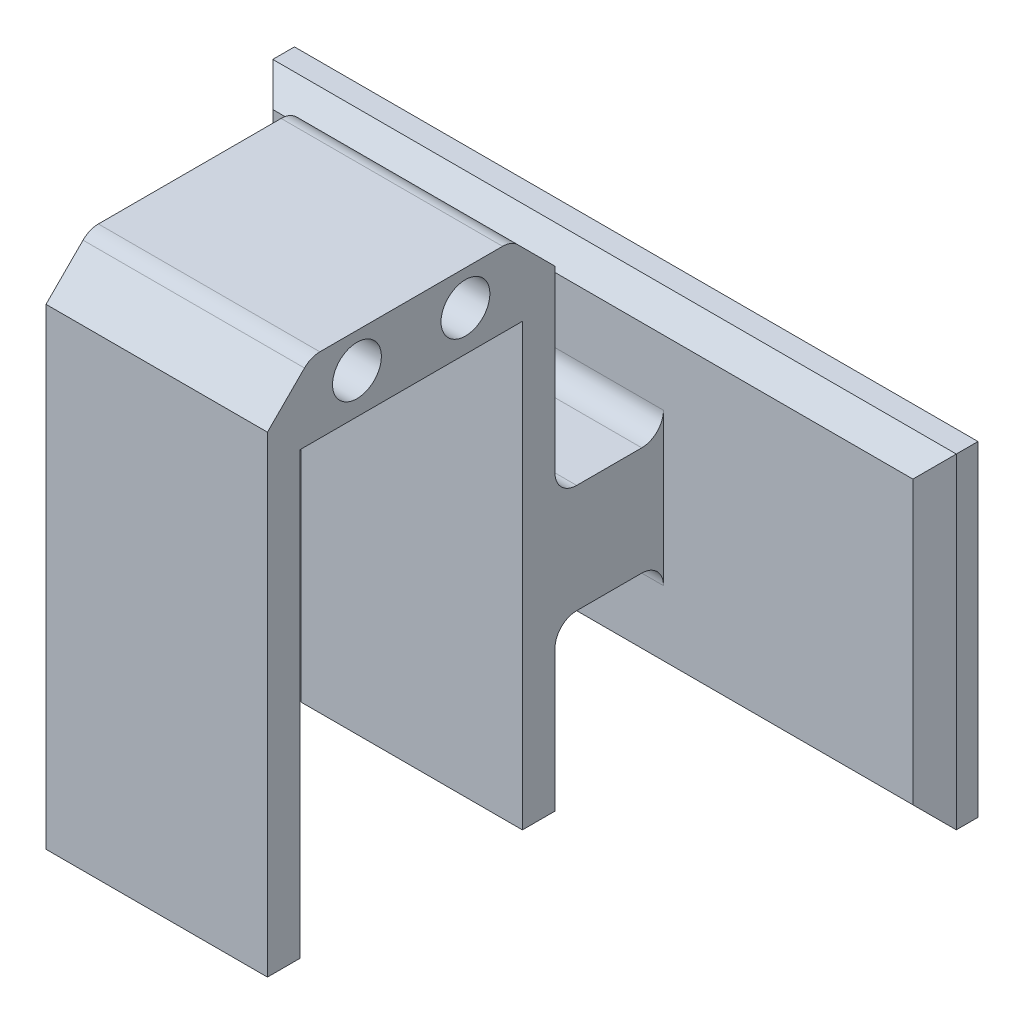
ISO-10303-21;
HEADER;
FILE_DESCRIPTION(('STEP AP214'),'2;1');
FILE_NAME('part.step','',(''),(''),'','','');
FILE_SCHEMA(('AUTOMOTIVE_DESIGN { 1 0 10303 214 1 1 1 1 }'));
ENDSEC;
DATA;
#1=APPLICATION_CONTEXT('core data for automotive mechanical design processes');
#2=APPLICATION_PROTOCOL_DEFINITION('international standard','automotive_design',2000,#1);
#3=PRODUCT_CONTEXT('',#1,'mechanical');
#4=PRODUCT('Part','Part','',(#3));
#5=PRODUCT_RELATED_PRODUCT_CATEGORY('part','',(#4));
#6=PRODUCT_DEFINITION_FORMATION('','',#4);
#7=PRODUCT_DEFINITION_CONTEXT('part definition',#1,'design');
#8=PRODUCT_DEFINITION('design','',#6,#7);
#9=PRODUCT_DEFINITION_SHAPE('','',#8);
#10=(LENGTH_UNIT() NAMED_UNIT(*) SI_UNIT(.MILLI.,.METRE.));
#11=(NAMED_UNIT(*) PLANE_ANGLE_UNIT() SI_UNIT($,.RADIAN.));
#12=(NAMED_UNIT(*) SI_UNIT($,.STERADIAN.) SOLID_ANGLE_UNIT());
#13=UNCERTAINTY_MEASURE_WITH_UNIT(LENGTH_MEASURE(1.E-05),#10,'distance_accuracy_value','');
#14=(GEOMETRIC_REPRESENTATION_CONTEXT(3) GLOBAL_UNCERTAINTY_ASSIGNED_CONTEXT((#13)) GLOBAL_UNIT_ASSIGNED_CONTEXT((#10,
#11,#12)) REPRESENTATION_CONTEXT('',''));
#15=CARTESIAN_POINT('',(0.,0.,0.));
#16=DIRECTION('',(0.,0.,1.));
#17=DIRECTION('',(1.,0.,0.));
#18=AXIS2_PLACEMENT_3D('',#15,#16,#17);
#19=CARTESIAN_POINT('',(20.,0.,-13.25));
#20=DIRECTION('',(0.,0.,1.));
#21=DIRECTION('',(0.,-1.,0.));
#22=AXIS2_PLACEMENT_3D('',#19,#20,#21);
#23=PLANE('',#22);
#24=DIRECTION('',(1.,0.,0.));
#25=VECTOR('',#24,1.);
#26=CARTESIAN_POINT('',(20.,23.2,-13.25));
#27=LINE('',#26,#25);
#28=CARTESIAN_POINT('',(0.,23.2,-13.25));
#29=VERTEX_POINT('',#28);
#30=CARTESIAN_POINT('',(20.41,23.2,-13.25));
#31=VERTEX_POINT('',#30);
#32=EDGE_CURVE('E217',#29,#31,#27,.T.);
#33=ORIENTED_EDGE('',*,*,#32,.T.);
#34=DIRECTION('',(0.,1.,0.));
#35=VECTOR('',#34,1.);
#36=CARTESIAN_POINT('',(20.41,6.7,-13.25));
#37=LINE('',#36,#35);
#38=CARTESIAN_POINT('',(20.41,6.7,-13.25));
#39=VERTEX_POINT('',#38);
#40=EDGE_CURVE('E220',#39,#31,#37,.T.);
#41=ORIENTED_EDGE('',*,*,#40,.F.);
#42=DIRECTION('',(1.,0.,0.));
#43=VECTOR('',#42,1.);
#44=CARTESIAN_POINT('',(20.,6.7,-13.25));
#45=LINE('',#44,#43);
#46=CARTESIAN_POINT('',(0.,6.7,-13.25));
#47=VERTEX_POINT('',#46);
#48=EDGE_CURVE('E392',#39,#47,#45,.F.);
#49=ORIENTED_EDGE('',*,*,#48,.T.);
#50=DIRECTION('',(0.,1.,0.));
#51=VECTOR('',#50,1.);
#52=CARTESIAN_POINT('',(0.,0.,-13.25));
#53=LINE('',#52,#51);
#54=EDGE_CURVE('E222',#47,#29,#53,.T.);
#55=ORIENTED_EDGE('',*,*,#54,.T.);
#56=EDGE_LOOP('',(#33,#41,#49,#55));
#57=FACE_BOUND('',#56,.T.);
#58=ADVANCED_FACE('F43',(#57),#23,.F.);
#59=CARTESIAN_POINT('',(20.,-20.3,0.));
#60=DIRECTION('',(0.,1.,0.));
#61=DIRECTION('',(0.,0.,1.));
#62=AXIS2_PLACEMENT_3D('',#59,#60,#61);
#63=PLANE('',#62);
#64=DIRECTION('',(0.,0.,-1.));
#65=VECTOR('',#64,1.);
#66=CARTESIAN_POINT('',(0.,-20.3,0.));
#67=LINE('',#66,#65);
#68=CARTESIAN_POINT('',(0.,-20.3,-10.25));
#69=VERTEX_POINT('',#68);
#70=CARTESIAN_POINT('',(0.,-20.3,-13.25));
#71=VERTEX_POINT('',#70);
#72=EDGE_CURVE('E339',#69,#71,#67,.T.);
#73=ORIENTED_EDGE('',*,*,#72,.T.);
#74=DIRECTION('',(-1.,0.,0.));
#75=VECTOR('',#74,1.);
#76=CARTESIAN_POINT('',(20.,-20.3,-13.25));
#77=LINE('',#76,#75);
#78=CARTESIAN_POINT('',(20.41,-20.3,-13.25));
#79=VERTEX_POINT('',#78);
#80=EDGE_CURVE('E227',#79,#71,#77,.T.);
#81=ORIENTED_EDGE('',*,*,#80,.F.);
#82=DIRECTION('',(0.,0.,-1.));
#83=VECTOR('',#82,1.);
#84=CARTESIAN_POINT('',(20.41,-20.3,-10.25));
#85=LINE('',#84,#83);
#86=CARTESIAN_POINT('',(20.41,-20.3,-10.25));
#87=VERTEX_POINT('',#86);
#88=EDGE_CURVE('E277',#87,#79,#85,.T.);
#89=ORIENTED_EDGE('',*,*,#88,.F.);
#90=DIRECTION('',(-1.,0.,0.));
#91=VECTOR('',#90,1.);
#92=CARTESIAN_POINT('',(20.,-20.3,-10.25));
#93=LINE('',#92,#91);
#94=EDGE_CURVE('E359',#87,#69,#93,.T.);
#95=ORIENTED_EDGE('',*,*,#94,.T.);
#96=EDGE_LOOP('',(#73,#81,#89,#95));
#97=FACE_BOUND('',#96,.T.);
#98=ADVANCED_FACE('F488',(#97),#63,.F.);
#99=CARTESIAN_POINT('',(0.,-7.3,-13.25));
#100=VERTEX_POINT('',#99);
#101=EDGE_CURVE('E342',#71,#100,#53,.T.);
#102=ORIENTED_EDGE('',*,*,#101,.T.);
#103=DIRECTION('',(1.,0.,0.));
#104=VECTOR('',#103,1.);
#105=CARTESIAN_POINT('',(20.,-7.3,-13.25));
#106=LINE('',#105,#104);
#107=CARTESIAN_POINT('',(20.41,-7.3,-13.25));
#108=VERTEX_POINT('',#107);
#109=EDGE_CURVE('E394',#100,#108,#106,.T.);
#110=ORIENTED_EDGE('',*,*,#109,.T.);
#111=DIRECTION('',(0.,1.,0.));
#112=VECTOR('',#111,1.);
#113=CARTESIAN_POINT('',(20.41,-20.3,-13.25));
#114=LINE('',#113,#112);
#115=EDGE_CURVE('E280',#79,#108,#114,.T.);
#116=ORIENTED_EDGE('',*,*,#115,.F.);
#117=ORIENTED_EDGE('',*,*,#80,.T.);
#118=EDGE_LOOP('',(#102,#110,#116,#117));
#119=FACE_BOUND('',#118,.T.);
#120=ADVANCED_FACE('F490',(#119),#23,.F.);
#121=CARTESIAN_POINT('',(20.,0.,13.25));
#122=DIRECTION('',(0.,0.,1.));
#123=DIRECTION('',(1.,0.,0.));
#124=AXIS2_PLACEMENT_3D('',#121,#122,#123);
#125=PLANE('',#124);
#126=DIRECTION('',(-1.,0.,0.));
#127=VECTOR('',#126,1.);
#128=CARTESIAN_POINT('',(20.,-20.3,13.25));
#129=LINE('',#128,#127);
#130=CARTESIAN_POINT('',(20.41,-20.3,13.25));
#131=VERTEX_POINT('',#130);
#132=CARTESIAN_POINT('',(0.,-20.3,13.25));
#133=VERTEX_POINT('',#132);
#134=EDGE_CURVE('E368',#131,#133,#129,.T.);
#135=ORIENTED_EDGE('',*,*,#134,.F.);
#136=DIRECTION('',(0.,-1.,0.));
#137=VECTOR('',#136,1.);
#138=CARTESIAN_POINT('',(20.41,23.2,13.25));
#139=LINE('',#138,#137);
#140=CARTESIAN_POINT('',(20.41,23.2,13.25));
#141=VERTEX_POINT('',#140);
#142=EDGE_CURVE('E262',#141,#131,#139,.T.);
#143=ORIENTED_EDGE('',*,*,#142,.F.);
#144=DIRECTION('',(-1.,0.,0.));
#145=VECTOR('',#144,1.);
#146=CARTESIAN_POINT('',(0.,23.2,13.25));
#147=LINE('',#146,#145);
#148=CARTESIAN_POINT('',(0.,23.2,13.25));
#149=VERTEX_POINT('',#148);
#150=EDGE_CURVE('E373',#141,#149,#147,.T.);
#151=ORIENTED_EDGE('',*,*,#150,.T.);
#152=DIRECTION('',(0.,1.,0.));
#153=VECTOR('',#152,1.);
#154=CARTESIAN_POINT('',(0.,0.,13.25));
#155=LINE('',#154,#153);
#156=EDGE_CURVE('E345',#133,#149,#155,.T.);
#157=ORIENTED_EDGE('',*,*,#156,.F.);
#158=EDGE_LOOP('',(#135,#143,#151,#157));
#159=FACE_BOUND('',#158,.T.);
#160=ADVANCED_FACE('F467',(#159),#125,.T.);
#161=CARTESIAN_POINT('',(20.,-20.3,0.));
#162=DIRECTION('',(0.,-1.,0.));
#163=DIRECTION('',(0.,0.,-1.));
#164=AXIS2_PLACEMENT_3D('',#161,#162,#163);
#165=PLANE('',#164);
#166=DIRECTION('',(0.,0.,1.));
#167=VECTOR('',#166,1.);
#168=CARTESIAN_POINT('',(0.,-20.3,0.));
#169=LINE('',#168,#167);
#170=CARTESIAN_POINT('',(0.,-20.3,10.25));
#171=VERTEX_POINT('',#170);
#172=EDGE_CURVE('E348',#171,#133,#169,.T.);
#173=ORIENTED_EDGE('',*,*,#172,.F.);
#174=DIRECTION('',(-1.,0.,0.));
#175=VECTOR('',#174,1.);
#176=CARTESIAN_POINT('',(20.,-20.3,10.25));
#177=LINE('',#176,#175);
#178=CARTESIAN_POINT('',(20.41,-20.3,10.25));
#179=VERTEX_POINT('',#178);
#180=EDGE_CURVE('E366',#179,#171,#177,.T.);
#181=ORIENTED_EDGE('',*,*,#180,.F.);
#182=DIRECTION('',(0.,0.,-1.));
#183=VECTOR('',#182,1.);
#184=CARTESIAN_POINT('',(20.41,-20.3,13.25));
#185=LINE('',#184,#183);
#186=EDGE_CURVE('E265',#131,#179,#185,.T.);
#187=ORIENTED_EDGE('',*,*,#186,.F.);
#188=ORIENTED_EDGE('',*,*,#134,.T.);
#189=EDGE_LOOP('',(#173,#181,#187,#188));
#190=FACE_BOUND('',#189,.T.);
#191=ADVANCED_FACE('F472',(#190),#165,.T.);
#192=CARTESIAN_POINT('',(20.,0.,10.25));
#193=DIRECTION('',(0.,0.,1.));
#194=DIRECTION('',(1.,0.,0.));
#195=AXIS2_PLACEMENT_3D('',#192,#193,#194);
#196=PLANE('',#195);
#197=DIRECTION('',(0.,1.,0.));
#198=VECTOR('',#197,1.);
#199=CARTESIAN_POINT('',(0.,0.,10.25));
#200=LINE('',#199,#198);
#201=CARTESIAN_POINT('',(0.,20.3,10.25));
#202=VERTEX_POINT('',#201);
#203=EDGE_CURVE('E351',#171,#202,#200,.T.);
#204=ORIENTED_EDGE('',*,*,#203,.T.);
#205=DIRECTION('',(-1.,0.,0.));
#206=VECTOR('',#205,1.);
#207=CARTESIAN_POINT('',(20.,20.3,10.25));
#208=LINE('',#207,#206);
#209=CARTESIAN_POINT('',(20.41,20.3,10.25));
#210=VERTEX_POINT('',#209);
#211=EDGE_CURVE('E363',#210,#202,#208,.T.);
#212=ORIENTED_EDGE('',*,*,#211,.F.);
#213=DIRECTION('',(0.,1.,0.));
#214=VECTOR('',#213,1.);
#215=CARTESIAN_POINT('',(20.41,-20.3,10.25));
#216=LINE('',#215,#214);
#217=EDGE_CURVE('E268',#179,#210,#216,.T.);
#218=ORIENTED_EDGE('',*,*,#217,.F.);
#219=ORIENTED_EDGE('',*,*,#180,.T.);
#220=EDGE_LOOP('',(#204,#212,#218,#219));
#221=FACE_BOUND('',#220,.T.);
#222=ADVANCED_FACE('F477',(#221),#196,.F.);
#223=CARTESIAN_POINT('',(20.,20.3,0.));
#224=DIRECTION('',(0.,1.,0.));
#225=DIRECTION('',(0.,0.,1.));
#226=AXIS2_PLACEMENT_3D('',#223,#224,#225);
#227=PLANE('',#226);
#228=DIRECTION('',(0.,0.,-1.));
#229=VECTOR('',#228,1.);
#230=CARTESIAN_POINT('',(0.,20.3,0.));
#231=LINE('',#230,#229);
#232=CARTESIAN_POINT('',(0.,20.3,-10.25));
#233=VERTEX_POINT('',#232);
#234=EDGE_CURVE('E353',#202,#233,#231,.T.);
#235=ORIENTED_EDGE('',*,*,#234,.T.);
#236=DIRECTION('',(-1.,0.,0.));
#237=VECTOR('',#236,1.);
#238=CARTESIAN_POINT('',(20.,20.3,-10.25));
#239=LINE('',#238,#237);
#240=CARTESIAN_POINT('',(20.41,20.3,-10.25));
#241=VERTEX_POINT('',#240);
#242=EDGE_CURVE('E361',#241,#233,#239,.T.);
#243=ORIENTED_EDGE('',*,*,#242,.F.);
#244=DIRECTION('',(0.,0.,-1.));
#245=VECTOR('',#244,1.);
#246=CARTESIAN_POINT('',(20.41,20.3,10.25));
#247=LINE('',#246,#245);
#248=EDGE_CURVE('E271',#210,#241,#247,.T.);
#249=ORIENTED_EDGE('',*,*,#248,.F.);
#250=ORIENTED_EDGE('',*,*,#211,.T.);
#251=EDGE_LOOP('',(#235,#243,#249,#250));
#252=FACE_BOUND('',#251,.T.);
#253=ADVANCED_FACE('F479',(#252),#227,.F.);
#254=CARTESIAN_POINT('',(20.,0.,-10.25));
#255=DIRECTION('',(0.,0.,1.));
#256=DIRECTION('',(1.,0.,0.));
#257=AXIS2_PLACEMENT_3D('',#254,#255,#256);
#258=PLANE('',#257);
#259=DIRECTION('',(0.,1.,0.));
#260=VECTOR('',#259,1.);
#261=CARTESIAN_POINT('',(0.,0.,-10.25));
#262=LINE('',#261,#260);
#263=EDGE_CURVE('E356',#69,#233,#262,.T.);
#264=ORIENTED_EDGE('',*,*,#263,.F.);
#265=ORIENTED_EDGE('',*,*,#94,.F.);
#266=DIRECTION('',(0.,-1.,0.));
#267=VECTOR('',#266,1.);
#268=CARTESIAN_POINT('',(20.41,20.3,-10.25));
#269=LINE('',#268,#267);
#270=EDGE_CURVE('E274',#241,#87,#269,.T.);
#271=ORIENTED_EDGE('',*,*,#270,.F.);
#272=ORIENTED_EDGE('',*,*,#242,.T.);
#273=EDGE_LOOP('',(#264,#265,#271,#272));
#274=FACE_BOUND('',#273,.T.);
#275=ADVANCED_FACE('F483',(#274),#258,.T.);
#276=CARTESIAN_POINT('',(0.,0.,0.));
#277=DIRECTION('',(1.,0.,0.));
#278=DIRECTION('',(0.,0.,-1.));
#279=AXIS2_PLACEMENT_3D('',#276,#277,#278);
#280=PLANE('',#279);
#281=DIRECTION('',(0.,0.,-1.));
#282=VECTOR('',#281,1.);
#283=CARTESIAN_POINT('',(0.,27.2,13.25));
#284=LINE('',#283,#282);
#285=CARTESIAN_POINT('',(0.,27.2,8.42157287525382));
#286=VERTEX_POINT('',#285);
#287=CARTESIAN_POINT('',(0.,27.2,-8.4215728752538));
#288=VERTEX_POINT('',#287);
#289=EDGE_CURVE('E330',#286,#288,#284,.T.);
#290=ORIENTED_EDGE('',*,*,#289,.T.);
#291=CARTESIAN_POINT('',(0.,25.2,-8.4215728752538));
#292=DIRECTION('',(1.,0.,0.));
#293=DIRECTION('',(0.,0.,-1.));
#294=AXIS2_PLACEMENT_3D('',#291,#292,#293);
#295=CIRCLE('',#294,2.);
#296=CARTESIAN_POINT('',(0.,26.6142135623731,-9.83578643762689));
#297=VERTEX_POINT('',#296);
#298=EDGE_CURVE('E385',#288,#297,#295,.F.);
#299=ORIENTED_EDGE('',*,*,#298,.T.);
#300=DIRECTION('',(0.,0.707106781186546,0.707106781186549));
#301=VECTOR('',#300,1.);
#302=CARTESIAN_POINT('',(0.,23.2,-13.25));
#303=LINE('',#302,#301);
#304=EDGE_CURVE('E226',#297,#29,#303,.F.);
#305=ORIENTED_EDGE('',*,*,#304,.T.);
#306=ORIENTED_EDGE('',*,*,#54,.F.);
#307=CARTESIAN_POINT('',(0.,6.7,-15.25));
#308=DIRECTION('',(1.,0.,0.));
#309=DIRECTION('',(0.,0.,-1.));
#310=AXIS2_PLACEMENT_3D('',#307,#308,#309);
#311=CIRCLE('',#310,2.);
#312=CARTESIAN_POINT('',(0.,4.7,-15.25));
#313=VERTEX_POINT('',#312);
#314=EDGE_CURVE('E399',#47,#313,#311,.T.);
#315=ORIENTED_EDGE('',*,*,#314,.T.);
#316=DIRECTION('',(0.,0.,-1.));
#317=VECTOR('',#316,1.);
#318=CARTESIAN_POINT('',(0.,4.7,-13.25));
#319=LINE('',#318,#317);
#320=CARTESIAN_POINT('',(0.,4.7,-21.25));
#321=VERTEX_POINT('',#320);
#322=EDGE_CURVE('E327',#313,#321,#319,.T.);
#323=ORIENTED_EDGE('',*,*,#322,.T.);
#324=CARTESIAN_POINT('',(0.,6.7,-21.25));
#325=DIRECTION('',(1.,0.,0.));
#326=DIRECTION('',(0.,0.,-1.));
#327=AXIS2_PLACEMENT_3D('',#324,#325,#326);
#328=CIRCLE('',#327,2.);
#329=CARTESIAN_POINT('',(0.,6.7,-23.25));
#330=VERTEX_POINT('',#329);
#331=EDGE_CURVE('E51',#321,#330,#328,.T.);
#332=ORIENTED_EDGE('',*,*,#331,.T.);
#333=DIRECTION('',(0.,-1.,0.));
#334=VECTOR('',#333,1.);
#335=CARTESIAN_POINT('',(0.,4.7,-23.25));
#336=LINE('',#335,#334);
#337=CARTESIAN_POINT('',(0.,-7.3,-23.25));
#338=VERTEX_POINT('',#337);
#339=EDGE_CURVE('E325',#330,#338,#336,.T.);
#340=ORIENTED_EDGE('',*,*,#339,.T.);
#341=CARTESIAN_POINT('',(0.,-7.3,-21.25));
#342=DIRECTION('',(1.,0.,0.));
#343=DIRECTION('',(0.,0.,-1.));
#344=AXIS2_PLACEMENT_3D('',#341,#342,#343);
#345=CIRCLE('',#344,2.);
#346=CARTESIAN_POINT('',(0.,-5.3,-21.25));
#347=VERTEX_POINT('',#346);
#348=EDGE_CURVE('E11',#338,#347,#345,.T.);
#349=ORIENTED_EDGE('',*,*,#348,.T.);
#350=DIRECTION('',(0.,0.,1.));
#351=VECTOR('',#350,1.);
#352=CARTESIAN_POINT('',(0.,-5.3,-23.25));
#353=LINE('',#352,#351);
#354=CARTESIAN_POINT('',(0.,-5.3,-15.25));
#355=VERTEX_POINT('',#354);
#356=EDGE_CURVE('E323',#347,#355,#353,.T.);
#357=ORIENTED_EDGE('',*,*,#356,.T.);
#358=CARTESIAN_POINT('',(0.,-7.3,-15.25));
#359=DIRECTION('',(1.,0.,0.));
#360=DIRECTION('',(0.,0.,-1.));
#361=AXIS2_PLACEMENT_3D('',#358,#359,#360);
#362=CIRCLE('',#361,2.);
#363=EDGE_CURVE('E401',#355,#100,#362,.T.);
#364=ORIENTED_EDGE('',*,*,#363,.T.);
#365=ORIENTED_EDGE('',*,*,#101,.F.);
#366=ORIENTED_EDGE('',*,*,#72,.F.);
#367=ORIENTED_EDGE('',*,*,#263,.T.);
#368=ORIENTED_EDGE('',*,*,#234,.F.);
#369=ORIENTED_EDGE('',*,*,#203,.F.);
#370=ORIENTED_EDGE('',*,*,#172,.T.);
#371=ORIENTED_EDGE('',*,*,#156,.T.);
#372=DIRECTION('',(0.,0.707106781186549,-0.707106781186546));
#373=VECTOR('',#372,1.);
#374=CARTESIAN_POINT('',(0.,27.2,9.25000000000001));
#375=LINE('',#374,#373);
#376=CARTESIAN_POINT('',(0.,26.6142135623731,9.83578643762692));
#377=VERTEX_POINT('',#376);
#378=EDGE_CURVE('E375',#149,#377,#375,.T.);
#379=ORIENTED_EDGE('',*,*,#378,.T.);
#380=CARTESIAN_POINT('',(0.,25.2,8.42157287525382));
#381=DIRECTION('',(1.,0.,0.));
#382=DIRECTION('',(0.,0.,-1.));
#383=AXIS2_PLACEMENT_3D('',#380,#381,#382);
#384=CIRCLE('',#383,2.);
#385=EDGE_CURVE('E383',#377,#286,#384,.F.);
#386=ORIENTED_EDGE('',*,*,#385,.T.);
#387=EDGE_LOOP('',(#290,#299,#305,#306,#315,#323,#332,#340,#349,#357,#364,#365,#366,#367,#368,
#369,#370,#371,#379,#386));
#388=FACE_BOUND('',#387,.T.);
#389=ADVANCED_FACE('F437',(#388),#280,.F.);
#390=CARTESIAN_POINT('',(0.,27.2,13.25));
#391=DIRECTION('',(0.,-1.,0.));
#392=DIRECTION('',(0.,0.,-1.));
#393=AXIS2_PLACEMENT_3D('',#390,#391,#392);
#394=PLANE('',#393);
#395=DIRECTION('',(1.,0.,0.));
#396=VECTOR('',#395,1.);
#397=CARTESIAN_POINT('',(20.,27.2,8.42157287525382));
#398=LINE('',#397,#396);
#399=CARTESIAN_POINT('',(20.41,27.2,8.42157287525382));
#400=VERTEX_POINT('',#399);
#401=EDGE_CURVE('E378',#286,#400,#398,.T.);
#402=ORIENTED_EDGE('',*,*,#401,.T.);
#403=DIRECTION('',(0.,0.,1.));
#404=VECTOR('',#403,1.);
#405=CARTESIAN_POINT('',(20.41,27.2,-8.4215728752538));
#406=LINE('',#405,#404);
#407=CARTESIAN_POINT('',(20.41,27.2,-8.4215728752538));
#408=VERTEX_POINT('',#407);
#409=EDGE_CURVE('E253',#408,#400,#406,.T.);
#410=ORIENTED_EDGE('',*,*,#409,.F.);
#411=DIRECTION('',(1.,0.,0.));
#412=VECTOR('',#411,1.);
#413=CARTESIAN_POINT('',(0.,27.2,-8.4215728752538));
#414=LINE('',#413,#412);
#415=EDGE_CURVE('E380',#408,#288,#414,.F.);
#416=ORIENTED_EDGE('',*,*,#415,.T.);
#417=ORIENTED_EDGE('',*,*,#289,.F.);
#418=EDGE_LOOP('',(#402,#410,#416,#417));
#419=FACE_BOUND('',#418,.T.);
#420=ADVANCED_FACE('F454',(#419),#394,.F.);
#421=CARTESIAN_POINT('',(20.,23.2,-13.25));
#422=DIRECTION('',(0.,-0.707106781186549,0.707106781186546));
#423=DIRECTION('',(1.,0.,0.));
#424=AXIS2_PLACEMENT_3D('',#421,#422,#423);
#425=PLANE('',#424);
#426=ORIENTED_EDGE('',*,*,#304,.F.);
#427=DIRECTION('',(-1.,0.,0.));
#428=VECTOR('',#427,1.);
#429=CARTESIAN_POINT('',(20.,26.6142135623731,-9.83578643762689));
#430=LINE('',#429,#428);
#431=CARTESIAN_POINT('',(20.41,26.6142135623731,-9.83578643762689));
#432=VERTEX_POINT('',#431);
#433=EDGE_CURVE('E233',#297,#432,#430,.F.);
#434=ORIENTED_EDGE('',*,*,#433,.T.);
#435=DIRECTION('',(0.,0.707106781186546,0.707106781186549));
#436=VECTOR('',#435,1.);
#437=CARTESIAN_POINT('',(20.41,23.2,-13.25));
#438=LINE('',#437,#436);
#439=EDGE_CURVE('E230',#31,#432,#438,.T.);
#440=ORIENTED_EDGE('',*,*,#439,.F.);
#441=ORIENTED_EDGE('',*,*,#32,.F.);
#442=EDGE_LOOP('',(#426,#434,#440,#441));
#443=FACE_BOUND('',#442,.T.);
#444=ADVANCED_FACE('F231',(#443),#425,.F.);
#445=CARTESIAN_POINT('',(0.,27.2,9.25000000000001));
#446=DIRECTION('',(0.,0.707106781186546,0.707106781186549));
#447=DIRECTION('',(-1.,0.,0.));
#448=AXIS2_PLACEMENT_3D('',#445,#446,#447);
#449=PLANE('',#448);
#450=ORIENTED_EDGE('',*,*,#150,.F.);
#451=DIRECTION('',(0.,-0.707106781186549,0.707106781186546));
#452=VECTOR('',#451,1.);
#453=CARTESIAN_POINT('',(20.41,26.6142135623731,9.83578643762692));
#454=LINE('',#453,#452);
#455=CARTESIAN_POINT('',(20.41,26.6142135623731,9.83578643762692));
#456=VERTEX_POINT('',#455);
#457=EDGE_CURVE('E259',#456,#141,#454,.T.);
#458=ORIENTED_EDGE('',*,*,#457,.F.);
#459=DIRECTION('',(1.,0.,0.));
#460=VECTOR('',#459,1.);
#461=CARTESIAN_POINT('',(0.,26.6142135623731,9.83578643762692));
#462=LINE('',#461,#460);
#463=EDGE_CURVE('E388',#456,#377,#462,.F.);
#464=ORIENTED_EDGE('',*,*,#463,.T.);
#465=ORIENTED_EDGE('',*,*,#378,.F.);
#466=EDGE_LOOP('',(#450,#458,#464,#465));
#467=FACE_BOUND('',#466,.T.);
#468=ADVANCED_FACE('F463',(#467),#449,.T.);
#469=CARTESIAN_POINT('',(0.,25.2,-8.4215728752538));
#470=DIRECTION('',(-1.,0.,0.));
#471=DIRECTION('',(0.,0.,1.));
#472=AXIS2_PLACEMENT_3D('',#469,#470,#471);
#473=CYLINDRICAL_SURFACE('',#472,2.);
#474=ORIENTED_EDGE('',*,*,#415,.F.);
#475=CARTESIAN_POINT('',(20.41,25.2,-8.4215728752538));
#476=DIRECTION('',(1.,0.,0.));
#477=DIRECTION('',(0.,0.,-1.));
#478=AXIS2_PLACEMENT_3D('',#475,#476,#477);
#479=CIRCLE('',#478,2.);
#480=EDGE_CURVE('E237',#432,#408,#479,.T.);
#481=ORIENTED_EDGE('',*,*,#480,.F.);
#482=ORIENTED_EDGE('',*,*,#433,.F.);
#483=ORIENTED_EDGE('',*,*,#298,.F.);
#484=EDGE_LOOP('',(#474,#481,#482,#483));
#485=FACE_BOUND('',#484,.T.);
#486=ADVANCED_FACE('F450',(#485),#473,.T.);
#487=CARTESIAN_POINT('',(0.,25.2,8.42157287525382));
#488=DIRECTION('',(-1.,0.,0.));
#489=DIRECTION('',(0.,0.,1.));
#490=AXIS2_PLACEMENT_3D('',#487,#488,#489);
#491=CYLINDRICAL_SURFACE('',#490,2.);
#492=ORIENTED_EDGE('',*,*,#385,.F.);
#493=ORIENTED_EDGE('',*,*,#463,.F.);
#494=CARTESIAN_POINT('',(20.41,25.2,8.42157287525382));
#495=DIRECTION('',(1.,0.,0.));
#496=DIRECTION('',(0.,0.,-1.));
#497=AXIS2_PLACEMENT_3D('',#494,#495,#496);
#498=CIRCLE('',#497,2.);
#499=EDGE_CURVE('E256',#400,#456,#498,.T.);
#500=ORIENTED_EDGE('',*,*,#499,.F.);
#501=ORIENTED_EDGE('',*,*,#401,.F.);
#502=EDGE_LOOP('',(#492,#493,#500,#501));
#503=FACE_BOUND('',#502,.T.);
#504=ADVANCED_FACE('F459',(#503),#491,.T.);
#505=CARTESIAN_POINT('',(-14.142135623731,-5.3,-23.25));
#506=DIRECTION('',(0.,-1.,0.));
#507=DIRECTION('',(0.,0.,-1.));
#508=AXIS2_PLACEMENT_3D('',#505,#506,#507);
#509=PLANE('',#508);
#510=ORIENTED_EDGE('',*,*,#356,.F.);
#511=DIRECTION('',(1.,0.,0.));
#512=VECTOR('',#511,1.);
#513=CARTESIAN_POINT('',(-14.142135623731,-5.3,-21.25));
#514=LINE('',#513,#512);
#515=CARTESIAN_POINT('',(20.41,-5.3,-21.25));
#516=VERTEX_POINT('',#515);
#517=EDGE_CURVE('E433',#347,#516,#514,.T.);
#518=ORIENTED_EDGE('',*,*,#517,.T.);
#519=DIRECTION('',(0.,0.,-1.));
#520=VECTOR('',#519,1.);
#521=CARTESIAN_POINT('',(20.41,-5.3,-15.25));
#522=LINE('',#521,#520);
#523=CARTESIAN_POINT('',(20.41,-5.3,-15.25));
#524=VERTEX_POINT('',#523);
#525=EDGE_CURVE('E286',#524,#516,#522,.T.);
#526=ORIENTED_EDGE('',*,*,#525,.F.);
#527=DIRECTION('',(1.,0.,0.));
#528=VECTOR('',#527,1.);
#529=CARTESIAN_POINT('',(-14.142135623731,-5.3,-15.25));
#530=LINE('',#529,#528);
#531=EDGE_CURVE('E396',#524,#355,#530,.F.);
#532=ORIENTED_EDGE('',*,*,#531,.T.);
#533=EDGE_LOOP('',(#510,#518,#526,#532));
#534=FACE_BOUND('',#533,.T.);
#535=ADVANCED_FACE('F499',(#534),#509,.T.);
#536=CARTESIAN_POINT('',(-14.142135623731,4.7,-13.25));
#537=DIRECTION('',(0.,1.,0.));
#538=DIRECTION('',(0.,0.,1.));
#539=AXIS2_PLACEMENT_3D('',#536,#537,#538);
#540=PLANE('',#539);
#541=DIRECTION('',(1.,0.,0.));
#542=VECTOR('',#541,1.);
#543=CARTESIAN_POINT('',(-14.142135623731,4.7,-15.25));
#544=LINE('',#543,#542);
#545=CARTESIAN_POINT('',(20.41,4.7,-15.25));
#546=VERTEX_POINT('',#545);
#547=EDGE_CURVE('E390',#313,#546,#544,.T.);
#548=ORIENTED_EDGE('',*,*,#547,.T.);
#549=DIRECTION('',(0.,0.,1.));
#550=VECTOR('',#549,1.);
#551=CARTESIAN_POINT('',(20.41,4.7,-21.25));
#552=LINE('',#551,#550);
#553=CARTESIAN_POINT('',(20.41,4.7,-21.25));
#554=VERTEX_POINT('',#553);
#555=EDGE_CURVE('E297',#554,#546,#552,.T.);
#556=ORIENTED_EDGE('',*,*,#555,.F.);
#557=DIRECTION('',(1.,0.,0.));
#558=VECTOR('',#557,1.);
#559=CARTESIAN_POINT('',(-14.142135623731,4.7,-21.25));
#560=LINE('',#559,#558);
#561=EDGE_CURVE('E431',#554,#321,#560,.F.);
#562=ORIENTED_EDGE('',*,*,#561,.T.);
#563=ORIENTED_EDGE('',*,*,#322,.F.);
#564=EDGE_LOOP('',(#548,#556,#562,#563));
#565=FACE_BOUND('',#564,.T.);
#566=ADVANCED_FACE('F444',(#565),#540,.T.);
#567=CARTESIAN_POINT('',(-14.142135623731,6.7,-15.25));
#568=DIRECTION('',(1.,0.,0.));
#569=DIRECTION('',(0.,0.,-1.));
#570=AXIS2_PLACEMENT_3D('',#567,#568,#569);
#571=CYLINDRICAL_SURFACE('',#570,2.);
#572=ORIENTED_EDGE('',*,*,#314,.F.);
#573=ORIENTED_EDGE('',*,*,#48,.F.);
#574=CARTESIAN_POINT('',(20.41,6.7,-15.25));
#575=DIRECTION('',(-1.,0.,0.));
#576=DIRECTION('',(0.,0.,-1.));
#577=AXIS2_PLACEMENT_3D('',#574,#575,#576);
#578=CIRCLE('',#577,2.);
#579=EDGE_CURVE('E244',#546,#39,#578,.T.);
#580=ORIENTED_EDGE('',*,*,#579,.F.);
#581=ORIENTED_EDGE('',*,*,#547,.F.);
#582=EDGE_LOOP('',(#572,#573,#580,#581));
#583=FACE_BOUND('',#582,.T.);
#584=ADVANCED_FACE('F448',(#583),#571,.F.);
#585=CARTESIAN_POINT('',(20.,-7.3,-15.25));
#586=DIRECTION('',(1.,0.,0.));
#587=DIRECTION('',(0.,0.,-1.));
#588=AXIS2_PLACEMENT_3D('',#585,#586,#587);
#589=CYLINDRICAL_SURFACE('',#588,2.);
#590=ORIENTED_EDGE('',*,*,#363,.F.);
#591=ORIENTED_EDGE('',*,*,#531,.F.);
#592=CARTESIAN_POINT('',(20.41,-7.3,-15.25));
#593=DIRECTION('',(-1.,0.,0.));
#594=DIRECTION('',(0.,0.,-1.));
#595=AXIS2_PLACEMENT_3D('',#592,#593,#594);
#596=CIRCLE('',#595,2.);
#597=EDGE_CURVE('E283',#108,#524,#596,.T.);
#598=ORIENTED_EDGE('',*,*,#597,.F.);
#599=ORIENTED_EDGE('',*,*,#109,.F.);
#600=EDGE_LOOP('',(#590,#591,#598,#599));
#601=FACE_BOUND('',#600,.T.);
#602=ADVANCED_FACE('F496',(#601),#589,.F.);
#603=CARTESIAN_POINT('',(45.4,14.7,-27.25));
#604=DIRECTION('',(-1.,0.,0.));
#605=DIRECTION('',(0.,0.,1.));
#606=AXIS2_PLACEMENT_3D('',#603,#604,#605);
#607=PLANE('',#606);
#608=DIRECTION('',(0.,0.,1.));
#609=VECTOR('',#608,1.);
#610=CARTESIAN_POINT('',(45.4,14.7,-27.25));
#611=LINE('',#610,#609);
#612=CARTESIAN_POINT('',(45.4,14.7,-27.25));
#613=VERTEX_POINT('',#612);
#614=CARTESIAN_POINT('',(45.4,14.7,-25.25));
#615=VERTEX_POINT('',#614);
#616=EDGE_CURVE('E311',#613,#615,#611,.T.);
#617=ORIENTED_EDGE('',*,*,#616,.T.);
#618=DIRECTION('',(0.,-1.,0.));
#619=VECTOR('',#618,1.);
#620=CARTESIAN_POINT('',(45.4,14.7,-25.25));
#621=LINE('',#620,#619);
#622=CARTESIAN_POINT('',(45.4,-15.3,-25.25));
#623=VERTEX_POINT('',#622);
#624=EDGE_CURVE('E417',#615,#623,#621,.T.);
#625=ORIENTED_EDGE('',*,*,#624,.T.);
#626=DIRECTION('',(0.,0.,1.));
#627=VECTOR('',#626,1.);
#628=CARTESIAN_POINT('',(45.4,-15.3,-27.25));
#629=LINE('',#628,#627);
#630=CARTESIAN_POINT('',(45.4,-15.3,-27.25));
#631=VERTEX_POINT('',#630);
#632=EDGE_CURVE('E320',#631,#623,#629,.T.);
#633=ORIENTED_EDGE('',*,*,#632,.F.);
#634=DIRECTION('',(0.,-1.,0.));
#635=VECTOR('',#634,1.);
#636=CARTESIAN_POINT('',(45.4,14.7,-27.25));
#637=LINE('',#636,#635);
#638=EDGE_CURVE('E301',#613,#631,#637,.T.);
#639=ORIENTED_EDGE('',*,*,#638,.F.);
#640=EDGE_LOOP('',(#617,#625,#633,#639));
#641=FACE_BOUND('',#640,.T.);
#642=ADVANCED_FACE('F549',(#641),#607,.F.);
#643=CARTESIAN_POINT('',(45.4,-15.3,-27.25));
#644=DIRECTION('',(0.,1.,0.));
#645=DIRECTION('',(-1.,0.,0.));
#646=AXIS2_PLACEMENT_3D('',#643,#644,#645);
#647=PLANE('',#646);
#648=ORIENTED_EDGE('',*,*,#632,.T.);
#649=DIRECTION('',(-1.,0.,0.));
#650=VECTOR('',#649,1.);
#651=CARTESIAN_POINT('',(45.4,-15.3,-25.25));
#652=LINE('',#651,#650);
#653=CARTESIAN_POINT('',(-17.6,-15.3,-25.25));
#654=VERTEX_POINT('',#653);
#655=EDGE_CURVE('E415',#623,#654,#652,.T.);
#656=ORIENTED_EDGE('',*,*,#655,.T.);
#657=DIRECTION('',(0.,0.,1.));
#658=VECTOR('',#657,1.);
#659=CARTESIAN_POINT('',(-17.6,-15.3,-27.25));
#660=LINE('',#659,#658);
#661=CARTESIAN_POINT('',(-17.6,-15.3,-27.25));
#662=VERTEX_POINT('',#661);
#663=EDGE_CURVE('E317',#662,#654,#660,.T.);
#664=ORIENTED_EDGE('',*,*,#663,.F.);
#665=DIRECTION('',(-1.,0.,0.));
#666=VECTOR('',#665,1.);
#667=CARTESIAN_POINT('',(45.4,-15.3,-27.25));
#668=LINE('',#667,#666);
#669=EDGE_CURVE('E304',#631,#662,#668,.T.);
#670=ORIENTED_EDGE('',*,*,#669,.F.);
#671=EDGE_LOOP('',(#648,#656,#664,#670));
#672=FACE_BOUND('',#671,.T.);
#673=ADVANCED_FACE('F552',(#672),#647,.F.);
#674=CARTESIAN_POINT('',(-17.6,14.7,-27.25));
#675=DIRECTION('',(1.,0.,0.));
#676=DIRECTION('',(0.,0.,-1.));
#677=AXIS2_PLACEMENT_3D('',#674,#675,#676);
#678=PLANE('',#677);
#679=ORIENTED_EDGE('',*,*,#663,.T.);
#680=DIRECTION('',(0.,1.,0.));
#681=VECTOR('',#680,1.);
#682=CARTESIAN_POINT('',(-17.6,14.7,-25.25));
#683=LINE('',#682,#681);
#684=CARTESIAN_POINT('',(-17.6,14.7,-25.25));
#685=VERTEX_POINT('',#684);
#686=EDGE_CURVE('E403',#654,#685,#683,.T.);
#687=ORIENTED_EDGE('',*,*,#686,.T.);
#688=DIRECTION('',(0.,0.,1.));
#689=VECTOR('',#688,1.);
#690=CARTESIAN_POINT('',(-17.6,14.7,-27.25));
#691=LINE('',#690,#689);
#692=CARTESIAN_POINT('',(-17.6,14.7,-27.25));
#693=VERTEX_POINT('',#692);
#694=EDGE_CURVE('E314',#693,#685,#691,.T.);
#695=ORIENTED_EDGE('',*,*,#694,.F.);
#696=DIRECTION('',(0.,1.,0.));
#697=VECTOR('',#696,1.);
#698=CARTESIAN_POINT('',(-17.6,14.7,-27.25));
#699=LINE('',#698,#697);
#700=EDGE_CURVE('E307',#662,#693,#699,.T.);
#701=ORIENTED_EDGE('',*,*,#700,.F.);
#702=EDGE_LOOP('',(#679,#687,#695,#701));
#703=FACE_BOUND('',#702,.T.);
#704=ADVANCED_FACE('F556',(#703),#678,.F.);
#705=CARTESIAN_POINT('',(45.4,14.7,-27.25));
#706=DIRECTION('',(0.,-1.,0.));
#707=DIRECTION('',(1.,0.,0.));
#708=AXIS2_PLACEMENT_3D('',#705,#706,#707);
#709=PLANE('',#708);
#710=ORIENTED_EDGE('',*,*,#694,.T.);
#711=DIRECTION('',(1.,0.,0.));
#712=VECTOR('',#711,1.);
#713=CARTESIAN_POINT('',(45.4,14.7,-25.25));
#714=LINE('',#713,#712);
#715=EDGE_CURVE('E419',#685,#615,#714,.T.);
#716=ORIENTED_EDGE('',*,*,#715,.T.);
#717=ORIENTED_EDGE('',*,*,#616,.F.);
#718=DIRECTION('',(1.,0.,0.));
#719=VECTOR('',#718,1.);
#720=CARTESIAN_POINT('',(45.4,14.7,-27.25));
#721=LINE('',#720,#719);
#722=EDGE_CURVE('E309',#693,#613,#721,.T.);
#723=ORIENTED_EDGE('',*,*,#722,.F.);
#724=EDGE_LOOP('',(#710,#716,#717,#723));
#725=FACE_BOUND('',#724,.T.);
#726=ADVANCED_FACE('F560',(#725),#709,.F.);
#727=CARTESIAN_POINT('',(0.,0.,-27.25));
#728=DIRECTION('',(0.,0.,-1.));
#729=DIRECTION('',(-1.,0.,0.));
#730=AXIS2_PLACEMENT_3D('',#727,#728,#729);
#731=PLANE('',#730);
#732=ORIENTED_EDGE('',*,*,#638,.T.);
#733=ORIENTED_EDGE('',*,*,#669,.T.);
#734=ORIENTED_EDGE('',*,*,#700,.T.);
#735=ORIENTED_EDGE('',*,*,#722,.T.);
#736=EDGE_LOOP('',(#732,#733,#734,#735));
#737=FACE_BOUND('',#736,.T.);
#738=ADVANCED_FACE('F564',(#737),#731,.T.);
#739=CARTESIAN_POINT('',(0.,0.,-23.25));
#740=DIRECTION('',(0.,0.,-1.));
#741=DIRECTION('',(-1.,0.,0.));
#742=AXIS2_PLACEMENT_3D('',#739,#740,#741);
#743=PLANE('',#742);
#744=DIRECTION('',(-1.,0.,0.));
#745=VECTOR('',#744,1.);
#746=CARTESIAN_POINT('',(0.,12.7,-23.25));
#747=LINE('',#746,#745);
#748=CARTESIAN_POINT('',(43.4,12.7,-23.25));
#749=VERTEX_POINT('',#748);
#750=CARTESIAN_POINT('',(-15.6,12.7,-23.25));
#751=VERTEX_POINT('',#750);
#752=EDGE_CURVE('E406',#749,#751,#747,.T.);
#753=ORIENTED_EDGE('',*,*,#752,.T.);
#754=DIRECTION('',(0.,-1.,0.));
#755=VECTOR('',#754,1.);
#756=CARTESIAN_POINT('',(-15.6,0.,-23.25));
#757=LINE('',#756,#755);
#758=CARTESIAN_POINT('',(-15.6,-13.3,-23.25));
#759=VERTEX_POINT('',#758);
#760=EDGE_CURVE('E412',#751,#759,#757,.T.);
#761=ORIENTED_EDGE('',*,*,#760,.T.);
#762=DIRECTION('',(1.,0.,0.));
#763=VECTOR('',#762,1.);
#764=CARTESIAN_POINT('',(0.,-13.3,-23.25));
#765=LINE('',#764,#763);
#766=CARTESIAN_POINT('',(43.4,-13.3,-23.25));
#767=VERTEX_POINT('',#766);
#768=EDGE_CURVE('E410',#759,#767,#765,.T.);
#769=ORIENTED_EDGE('',*,*,#768,.T.);
#770=DIRECTION('',(0.,1.,0.));
#771=VECTOR('',#770,1.);
#772=CARTESIAN_POINT('',(43.4,0.,-23.25));
#773=LINE('',#772,#771);
#774=EDGE_CURVE('E408',#767,#749,#773,.T.);
#775=ORIENTED_EDGE('',*,*,#774,.T.);
#776=EDGE_LOOP('',(#753,#761,#769,#775));
#777=FACE_BOUND('',#776,.T.);
#778=DIRECTION('',(0.,1.,0.));
#779=VECTOR('',#778,1.);
#780=CARTESIAN_POINT('',(20.41,-7.3,-23.25));
#781=LINE('',#780,#779);
#782=CARTESIAN_POINT('',(20.41,-7.3,-23.25));
#783=VERTEX_POINT('',#782);
#784=CARTESIAN_POINT('',(20.41,6.7,-23.25));
#785=VERTEX_POINT('',#784);
#786=EDGE_CURVE('E292',#783,#785,#781,.T.);
#787=ORIENTED_EDGE('',*,*,#786,.F.);
#788=DIRECTION('',(1.,0.,0.));
#789=VECTOR('',#788,1.);
#790=CARTESIAN_POINT('',(0.,-7.3,-23.25));
#791=LINE('',#790,#789);
#792=EDGE_CURVE('E58',#783,#338,#791,.F.);
#793=ORIENTED_EDGE('',*,*,#792,.T.);
#794=ORIENTED_EDGE('',*,*,#339,.F.);
#795=DIRECTION('',(1.,0.,0.));
#796=VECTOR('',#795,1.);
#797=CARTESIAN_POINT('',(0.,6.7,-23.25));
#798=LINE('',#797,#796);
#799=EDGE_CURVE('E65',#330,#785,#798,.T.);
#800=ORIENTED_EDGE('',*,*,#799,.T.);
#801=EDGE_LOOP('',(#787,#793,#794,#800));
#802=FACE_BOUND('',#801,.T.);
#803=ADVANCED_FACE('F566',(#777,#802),#743,.F.);
#804=CARTESIAN_POINT('',(45.4,14.7,-25.25));
#805=DIRECTION('',(-0.707106781186545,0.,-0.70710678118655));
#806=DIRECTION('',(0.,-1.,0.));
#807=AXIS2_PLACEMENT_3D('',#804,#805,#806);
#808=PLANE('',#807);
#809=DIRECTION('',(0.577350269189627,0.577350269189627,-0.577350269189623));
#810=VECTOR('',#809,1.);
#811=CARTESIAN_POINT('',(45.4,14.7,-25.25));
#812=LINE('',#811,#810);
#813=EDGE_CURVE('E424',#749,#615,#812,.T.);
#814=ORIENTED_EDGE('',*,*,#813,.F.);
#815=ORIENTED_EDGE('',*,*,#774,.F.);
#816=DIRECTION('',(0.577350269189627,-0.577350269189627,-0.577350269189623));
#817=VECTOR('',#816,1.);
#818=CARTESIAN_POINT('',(35.3999999999999,-5.29999999999996,-15.25));
#819=LINE('',#818,#817);
#820=EDGE_CURVE('E305',#623,#767,#819,.F.);
#821=ORIENTED_EDGE('',*,*,#820,.F.);
#822=ORIENTED_EDGE('',*,*,#624,.F.);
#823=EDGE_LOOP('',(#814,#815,#821,#822));
#824=FACE_BOUND('',#823,.T.);
#825=ADVANCED_FACE('F569',(#824),#808,.F.);
#826=CARTESIAN_POINT('',(45.4,-15.3,-25.25));
#827=DIRECTION('',(0.,0.707106781186545,-0.70710678118655));
#828=DIRECTION('',(-1.,0.,0.));
#829=AXIS2_PLACEMENT_3D('',#826,#827,#828);
#830=PLANE('',#829);
#831=ORIENTED_EDGE('',*,*,#820,.T.);
#832=ORIENTED_EDGE('',*,*,#768,.F.);
#833=DIRECTION('',(-0.577350269189627,-0.577350269189627,-0.577350269189623));
#834=VECTOR('',#833,1.);
#835=CARTESIAN_POINT('',(3.40000000000009,5.7000000000001,-4.25000000000005));
#836=LINE('',#835,#834);
#837=EDGE_CURVE('E422',#654,#759,#836,.F.);
#838=ORIENTED_EDGE('',*,*,#837,.F.);
#839=ORIENTED_EDGE('',*,*,#655,.F.);
#840=EDGE_LOOP('',(#831,#832,#838,#839));
#841=FACE_BOUND('',#840,.T.);
#842=ADVANCED_FACE('F589',(#841),#830,.F.);
#843=CARTESIAN_POINT('',(45.4,14.7,-25.25));
#844=DIRECTION('',(0.,-0.707106781186545,-0.70710678118655));
#845=DIRECTION('',(1.,0.,0.));
#846=AXIS2_PLACEMENT_3D('',#843,#844,#845);
#847=PLANE('',#846);
#848=ORIENTED_EDGE('',*,*,#813,.T.);
#849=ORIENTED_EDGE('',*,*,#715,.F.);
#850=DIRECTION('',(0.577350269189627,-0.577350269189627,0.577350269189623));
#851=VECTOR('',#850,1.);
#852=CARTESIAN_POINT('',(3.40000000000009,-6.3000000000001,-4.25000000000005));
#853=LINE('',#852,#851);
#854=EDGE_CURVE('E300',#751,#685,#853,.F.);
#855=ORIENTED_EDGE('',*,*,#854,.F.);
#856=ORIENTED_EDGE('',*,*,#752,.F.);
#857=EDGE_LOOP('',(#848,#849,#855,#856));
#858=FACE_BOUND('',#857,.T.);
#859=ADVANCED_FACE('F598',(#858),#847,.F.);
#860=CARTESIAN_POINT('',(-17.6,14.7,-25.25));
#861=DIRECTION('',(0.707106781186545,0.,-0.70710678118655));
#862=DIRECTION('',(0.,1.,0.));
#863=AXIS2_PLACEMENT_3D('',#860,#861,#862);
#864=PLANE('',#863);
#865=ORIENTED_EDGE('',*,*,#837,.T.);
#866=ORIENTED_EDGE('',*,*,#760,.F.);
#867=ORIENTED_EDGE('',*,*,#854,.T.);
#868=ORIENTED_EDGE('',*,*,#686,.F.);
#869=EDGE_LOOP('',(#865,#866,#867,#868));
#870=FACE_BOUND('',#869,.T.);
#871=ADVANCED_FACE('F509',(#870),#864,.F.);
#872=CARTESIAN_POINT('',(0.,6.7,-21.25));
#873=DIRECTION('',(1.,0.,0.));
#874=DIRECTION('',(0.,0.,-1.));
#875=AXIS2_PLACEMENT_3D('',#872,#873,#874);
#876=CYLINDRICAL_SURFACE('',#875,2.);
#877=ORIENTED_EDGE('',*,*,#331,.F.);
#878=ORIENTED_EDGE('',*,*,#561,.F.);
#879=CARTESIAN_POINT('',(20.41,6.7,-21.25));
#880=DIRECTION('',(-1.,0.,0.));
#881=DIRECTION('',(0.,0.,-1.));
#882=AXIS2_PLACEMENT_3D('',#879,#880,#881);
#883=CIRCLE('',#882,2.);
#884=EDGE_CURVE('E294',#785,#554,#883,.T.);
#885=ORIENTED_EDGE('',*,*,#884,.F.);
#886=ORIENTED_EDGE('',*,*,#799,.F.);
#887=EDGE_LOOP('',(#877,#878,#885,#886));
#888=FACE_BOUND('',#887,.T.);
#889=ADVANCED_FACE('F441',(#888),#876,.F.);
#890=CARTESIAN_POINT('',(-14.142135623731,-7.3,-21.25));
#891=DIRECTION('',(1.,0.,0.));
#892=DIRECTION('',(0.,0.,-1.));
#893=AXIS2_PLACEMENT_3D('',#890,#891,#892);
#894=CYLINDRICAL_SURFACE('',#893,2.);
#895=ORIENTED_EDGE('',*,*,#348,.F.);
#896=ORIENTED_EDGE('',*,*,#792,.F.);
#897=CARTESIAN_POINT('',(20.41,-7.3,-21.25));
#898=DIRECTION('',(-1.,0.,0.));
#899=DIRECTION('',(0.,0.,-1.));
#900=AXIS2_PLACEMENT_3D('',#897,#898,#899);
#901=CIRCLE('',#900,2.);
#902=EDGE_CURVE('E289',#516,#783,#901,.T.);
#903=ORIENTED_EDGE('',*,*,#902,.F.);
#904=ORIENTED_EDGE('',*,*,#517,.F.);
#905=EDGE_LOOP('',(#895,#896,#903,#904));
#906=FACE_BOUND('',#905,.T.);
#907=ADVANCED_FACE('F45',(#906),#894,.F.);
#908=CARTESIAN_POINT('',(20.41,25.2,-8.4215728752538));
#909=DIRECTION('',(1.,0.,0.));
#910=DIRECTION('',(0.,0.,-1.));
#911=AXIS2_PLACEMENT_3D('',#908,#909,#910);
#912=PLANE('',#911);
#913=CARTESIAN_POINT('',(20.41,24.,-5.00000000000001));
#914=DIRECTION('',(1.,0.,0.));
#915=DIRECTION('',(0.,0.,-1.));
#916=AXIS2_PLACEMENT_3D('',#913,#914,#915);
#917=CIRCLE('',#916,2.25);
#918=CARTESIAN_POINT('',(20.41,24.,-7.25000000000002));
#919=VERTEX_POINT('',#918);
#920=EDGE_CURVE('E245',#919,#919,#917,.T.);
#921=ORIENTED_EDGE('',*,*,#920,.F.);
#922=EDGE_LOOP('',(#921));
#923=FACE_BOUND('',#922,.T.);
#924=ORIENTED_EDGE('',*,*,#40,.T.);
#925=ORIENTED_EDGE('',*,*,#439,.T.);
#926=ORIENTED_EDGE('',*,*,#480,.T.);
#927=ORIENTED_EDGE('',*,*,#409,.T.);
#928=ORIENTED_EDGE('',*,*,#499,.T.);
#929=ORIENTED_EDGE('',*,*,#457,.T.);
#930=ORIENTED_EDGE('',*,*,#142,.T.);
#931=ORIENTED_EDGE('',*,*,#186,.T.);
#932=ORIENTED_EDGE('',*,*,#217,.T.);
#933=ORIENTED_EDGE('',*,*,#248,.T.);
#934=ORIENTED_EDGE('',*,*,#270,.T.);
#935=ORIENTED_EDGE('',*,*,#88,.T.);
#936=ORIENTED_EDGE('',*,*,#115,.T.);
#937=ORIENTED_EDGE('',*,*,#597,.T.);
#938=ORIENTED_EDGE('',*,*,#525,.T.);
#939=ORIENTED_EDGE('',*,*,#902,.T.);
#940=ORIENTED_EDGE('',*,*,#786,.T.);
#941=ORIENTED_EDGE('',*,*,#884,.T.);
#942=ORIENTED_EDGE('',*,*,#555,.T.);
#943=ORIENTED_EDGE('',*,*,#579,.T.);
#944=EDGE_LOOP('',(#924,#925,#926,#927,#928,#929,#930,#931,#932,#933,#934,#935,#936,#937,#938,
#939,#940,#941,#942,#943));
#945=FACE_BOUND('',#944,.T.);
#946=CARTESIAN_POINT('',(20.41,24.,4.99999999999999));
#947=DIRECTION('',(1.,0.,0.));
#948=DIRECTION('',(0.,0.,-1.));
#949=AXIS2_PLACEMENT_3D('',#946,#947,#948);
#950=CIRCLE('',#949,2.25);
#951=CARTESIAN_POINT('',(20.41,24.,2.74999999999999));
#952=VERTEX_POINT('',#951);
#953=EDGE_CURVE('E248',#952,#952,#950,.T.);
#954=ORIENTED_EDGE('',*,*,#953,.F.);
#955=EDGE_LOOP('',(#954));
#956=FACE_BOUND('',#955,.T.);
#957=ADVANCED_FACE('F240',(#923,#945,#956),#912,.T.);
#958=CARTESIAN_POINT('',(10.,24.,4.99999999999999));
#959=DIRECTION('',(-1.,0.,0.));
#960=DIRECTION('',(0.,0.,1.));
#961=AXIS2_PLACEMENT_3D('',#958,#959,#960);
#962=PLANE('',#961);
#963=CARTESIAN_POINT('',(10.,24.,4.99999999999999));
#964=DIRECTION('',(-1.,0.,0.));
#965=DIRECTION('',(0.,0.,1.));
#966=AXIS2_PLACEMENT_3D('',#963,#964,#965);
#967=CIRCLE('',#966,2.25);
#968=CARTESIAN_POINT('',(10.,24.,7.24999999999999));
#969=VERTEX_POINT('',#968);
#970=EDGE_CURVE('E333',#969,#969,#967,.T.);
#971=ORIENTED_EDGE('',*,*,#970,.F.);
#972=EDGE_LOOP('',(#971));
#973=FACE_BOUND('',#972,.T.);
#974=ADVANCED_FACE('F506',(#973),#962,.F.);
#975=CARTESIAN_POINT('',(20.,24.,4.99999999999999));
#976=DIRECTION('',(-1.,0.,0.));
#977=DIRECTION('',(0.,0.,1.));
#978=AXIS2_PLACEMENT_3D('',#975,#976,#977);
#979=CYLINDRICAL_SURFACE('',#978,2.25);
#980=ORIENTED_EDGE('',*,*,#970,.T.);
#981=EDGE_LOOP('',(#980));
#982=FACE_BOUND('',#981,.T.);
#983=ORIENTED_EDGE('',*,*,#953,.T.);
#984=EDGE_LOOP('',(#983));
#985=FACE_BOUND('',#984,.T.);
#986=ADVANCED_FACE('F538',(#982,#985),#979,.F.);
#987=CARTESIAN_POINT('',(10.,24.,-5.00000000000001));
#988=DIRECTION('',(-1.,0.,0.));
#989=DIRECTION('',(0.,0.,1.));
#990=AXIS2_PLACEMENT_3D('',#987,#988,#989);
#991=PLANE('',#990);
#992=CARTESIAN_POINT('',(10.,24.,-5.00000000000001));
#993=DIRECTION('',(-1.,0.,0.));
#994=DIRECTION('',(0.,0.,1.));
#995=AXIS2_PLACEMENT_3D('',#992,#993,#994);
#996=CIRCLE('',#995,2.25);
#997=CARTESIAN_POINT('',(10.,24.,-2.75000000000001));
#998=VERTEX_POINT('',#997);
#999=EDGE_CURVE('E336',#998,#998,#996,.T.);
#1000=ORIENTED_EDGE('',*,*,#999,.F.);
#1001=EDGE_LOOP('',(#1000));
#1002=FACE_BOUND('',#1001,.T.);
#1003=ADVANCED_FACE('F534',(#1002),#991,.F.);
#1004=CARTESIAN_POINT('',(20.,24.,-5.00000000000001));
#1005=DIRECTION('',(-1.,0.,0.));
#1006=DIRECTION('',(0.,0.,1.));
#1007=AXIS2_PLACEMENT_3D('',#1004,#1005,#1006);
#1008=CYLINDRICAL_SURFACE('',#1007,2.25);
#1009=ORIENTED_EDGE('',*,*,#999,.T.);
#1010=EDGE_LOOP('',(#1009));
#1011=FACE_BOUND('',#1010,.T.);
#1012=ORIENTED_EDGE('',*,*,#920,.T.);
#1013=EDGE_LOOP('',(#1012));
#1014=FACE_BOUND('',#1013,.T.);
#1015=ADVANCED_FACE('F537',(#1011,#1014),#1008,.F.);
#1016=CLOSED_SHELL('',(#58,#98,#120,#160,#191,#222,#253,#275,#389,#420,#444,#468,#486,#504,#535,
#566,#584,#602,#642,#673,#704,#726,#738,#803,#825,#842,#859,#871,#889,#907,#957,#974,#986,#1003,#1015));
#1017=MANIFOLD_SOLID_BREP('B2',#1016);
#1018=ADVANCED_BREP_SHAPE_REPRESENTATION('',(#18,#1017),#14);
#1019=SHAPE_DEFINITION_REPRESENTATION(#9,#1018);
ENDSEC;
END-ISO-10303-21;
